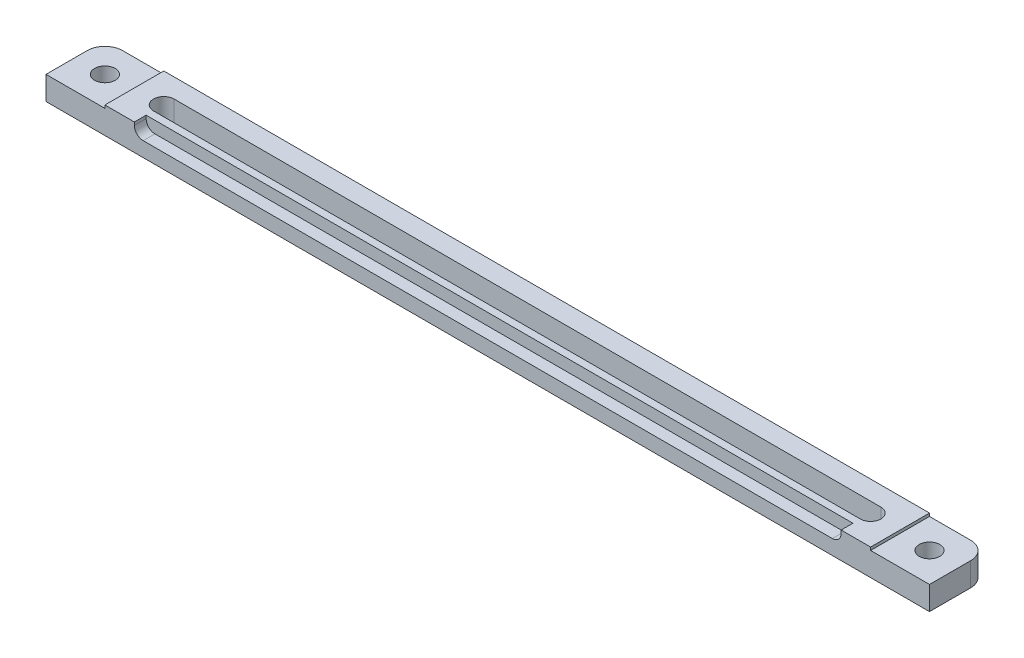
ISO-10303-21;
HEADER;
FILE_DESCRIPTION(('STEP AP214'),'2;1');
FILE_NAME('part.step','',(''),(''),'','','');
FILE_SCHEMA(('AUTOMOTIVE_DESIGN { 1 0 10303 214 1 1 1 1 }'));
ENDSEC;
DATA;
#1=APPLICATION_CONTEXT('core data for automotive mechanical design processes');
#2=APPLICATION_PROTOCOL_DEFINITION('international standard','automotive_design',2000,#1);
#3=PRODUCT_CONTEXT('',#1,'mechanical');
#4=PRODUCT('Part','Part','',(#3));
#5=PRODUCT_RELATED_PRODUCT_CATEGORY('part','',(#4));
#6=PRODUCT_DEFINITION_FORMATION('','',#4);
#7=PRODUCT_DEFINITION_CONTEXT('part definition',#1,'design');
#8=PRODUCT_DEFINITION('design','',#6,#7);
#9=PRODUCT_DEFINITION_SHAPE('','',#8);
#10=(LENGTH_UNIT() NAMED_UNIT(*) SI_UNIT(.MILLI.,.METRE.));
#11=(NAMED_UNIT(*) PLANE_ANGLE_UNIT() SI_UNIT($,.RADIAN.));
#12=(NAMED_UNIT(*) SI_UNIT($,.STERADIAN.) SOLID_ANGLE_UNIT());
#13=UNCERTAINTY_MEASURE_WITH_UNIT(LENGTH_MEASURE(1.E-05),#10,'distance_accuracy_value','');
#14=(GEOMETRIC_REPRESENTATION_CONTEXT(3) GLOBAL_UNCERTAINTY_ASSIGNED_CONTEXT((#13)) GLOBAL_UNIT_ASSIGNED_CONTEXT((#10,
#11,#12)) REPRESENTATION_CONTEXT('',''));
#15=CARTESIAN_POINT('',(0.,0.,0.));
#16=DIRECTION('',(0.,0.,1.));
#17=DIRECTION('',(1.,0.,0.));
#18=AXIS2_PLACEMENT_3D('',#15,#16,#17);
#19=CARTESIAN_POINT('',(0.,4.,0.));
#20=DIRECTION('',(0.,1.,0.));
#21=DIRECTION('',(0.,0.,1.));
#22=AXIS2_PLACEMENT_3D('',#19,#20,#21);
#23=PLANE('',#22);
#24=CARTESIAN_POINT('',(69.9999999999999,4.,0.));
#25=DIRECTION('',(0.,1.,0.));
#26=DIRECTION('',(0.,0.,1.));
#27=AXIS2_PLACEMENT_3D('',#24,#25,#26);
#28=CIRCLE('',#27,1.75);
#29=CARTESIAN_POINT('',(69.9999999999999,4.,1.74999999999999));
#30=VERTEX_POINT('',#29);
#31=EDGE_CURVE('E248',#30,#30,#28,.T.);
#32=ORIENTED_EDGE('',*,*,#31,.F.);
#33=EDGE_LOOP('',(#32));
#34=FACE_BOUND('',#33,.T.);
#35=DIRECTION('',(-1.,0.,0.));
#36=VECTOR('',#35,1.);
#37=CARTESIAN_POINT('',(0.,4.,-5.));
#38=LINE('',#37,#36);
#39=CARTESIAN_POINT('',(71.9999999999999,4.,-5.00000000000001));
#40=VERTEX_POINT('',#39);
#41=CARTESIAN_POINT('',(64.9999999999999,4.,-5.00000000000001));
#42=VERTEX_POINT('',#41);
#43=EDGE_CURVE('E253',#40,#42,#38,.T.);
#44=ORIENTED_EDGE('',*,*,#43,.T.);
#45=DIRECTION('',(0.,0.,1.));
#46=VECTOR('',#45,1.);
#47=CARTESIAN_POINT('',(64.9999999999999,4.,0.));
#48=LINE('',#47,#46);
#49=CARTESIAN_POINT('',(64.9999999999999,4.,4.99999999999999));
#50=VERTEX_POINT('',#49);
#51=EDGE_CURVE('E60',#42,#50,#48,.T.);
#52=ORIENTED_EDGE('',*,*,#51,.T.);
#53=DIRECTION('',(-1.,0.,0.));
#54=VECTOR('',#53,1.);
#55=CARTESIAN_POINT('',(0.,4.,5.));
#56=LINE('',#55,#54);
#57=CARTESIAN_POINT('',(74.9999999999999,4.,4.99999999999999));
#58=VERTEX_POINT('',#57);
#59=EDGE_CURVE('E261',#58,#50,#56,.T.);
#60=ORIENTED_EDGE('',*,*,#59,.F.);
#61=DIRECTION('',(0.,0.,1.));
#62=VECTOR('',#61,1.);
#63=CARTESIAN_POINT('',(74.9999999999999,4.,0.));
#64=LINE('',#63,#62);
#65=CARTESIAN_POINT('',(74.9999999999999,4.,-1.99999999999999));
#66=VERTEX_POINT('',#65);
#67=EDGE_CURVE('E263',#66,#58,#64,.T.);
#68=ORIENTED_EDGE('',*,*,#67,.F.);
#69=CARTESIAN_POINT('',(71.9999999999999,4.,-2.00000000000001));
#70=DIRECTION('',(0.,1.,0.));
#71=DIRECTION('',(0.,0.,1.));
#72=AXIS2_PLACEMENT_3D('',#69,#70,#71);
#73=CIRCLE('',#72,3.);
#74=EDGE_CURVE('E266',#66,#40,#73,.T.);
#75=ORIENTED_EDGE('',*,*,#74,.T.);
#76=EDGE_LOOP('',(#44,#52,#60,#68,#75));
#77=FACE_BOUND('',#76,.T.);
#78=ADVANCED_FACE('F35',(#34,#77),#23,.T.);
#79=CARTESIAN_POINT('',(0.,4.,-5.));
#80=DIRECTION('',(0.,0.,1.));
#81=DIRECTION('',(1.,0.,0.));
#82=AXIS2_PLACEMENT_3D('',#79,#80,#81);
#83=PLANE('',#82);
#84=DIRECTION('',(-1.,0.,0.));
#85=VECTOR('',#84,1.);
#86=CARTESIAN_POINT('',(0.,0.,-5.));
#87=LINE('',#86,#85);
#88=CARTESIAN_POINT('',(71.9999999999999,0.,-5.00000000000001));
#89=VERTEX_POINT('',#88);
#90=CARTESIAN_POINT('',(-72.0000000000001,0.,-4.99999999999999));
#91=VERTEX_POINT('',#90);
#92=EDGE_CURVE('E286',#89,#91,#87,.T.);
#93=ORIENTED_EDGE('',*,*,#92,.T.);
#94=DIRECTION('',(0.,-1.,0.));
#95=VECTOR('',#94,1.);
#96=CARTESIAN_POINT('',(-72.0000000000001,4.,-4.99999999999999));
#97=LINE('',#96,#95);
#98=CARTESIAN_POINT('',(-72.0000000000001,4.,-4.99999999999999));
#99=VERTEX_POINT('',#98);
#100=EDGE_CURVE('E11',#99,#91,#97,.T.);
#101=ORIENTED_EDGE('',*,*,#100,.F.);
#102=CARTESIAN_POINT('',(-65.0000000000001,4.,-4.99999999999999));
#103=VERTEX_POINT('',#102);
#104=EDGE_CURVE('E252',#103,#99,#38,.T.);
#105=ORIENTED_EDGE('',*,*,#104,.F.);
#106=DIRECTION('',(0.,-1.,0.));
#107=VECTOR('',#106,1.);
#108=CARTESIAN_POINT('',(-65.0000000000001,4.5,-4.99999999999999));
#109=LINE('',#108,#107);
#110=CARTESIAN_POINT('',(-65.0000000000001,4.5,-4.99999999999999));
#111=VERTEX_POINT('',#110);
#112=EDGE_CURVE('E238',#111,#103,#109,.T.);
#113=ORIENTED_EDGE('',*,*,#112,.F.);
#114=DIRECTION('',(-1.,0.,0.));
#115=VECTOR('',#114,1.);
#116=CARTESIAN_POINT('',(0.,4.5,-5.));
#117=LINE('',#116,#115);
#118=CARTESIAN_POINT('',(64.9999999999999,4.5,-5.00000000000001));
#119=VERTEX_POINT('',#118);
#120=EDGE_CURVE('E209',#119,#111,#117,.T.);
#121=ORIENTED_EDGE('',*,*,#120,.F.);
#122=DIRECTION('',(0.,-1.,0.));
#123=VECTOR('',#122,1.);
#124=CARTESIAN_POINT('',(64.9999999999999,4.5,-5.00000000000001));
#125=LINE('',#124,#123);
#126=EDGE_CURVE('E241',#119,#42,#125,.T.);
#127=ORIENTED_EDGE('',*,*,#126,.T.);
#128=ORIENTED_EDGE('',*,*,#43,.F.);
#129=DIRECTION('',(0.,-1.,0.));
#130=VECTOR('',#129,1.);
#131=CARTESIAN_POINT('',(71.9999999999999,4.,-5.00000000000001));
#132=LINE('',#131,#130);
#133=EDGE_CURVE('E301',#40,#89,#132,.T.);
#134=ORIENTED_EDGE('',*,*,#133,.T.);
#135=EDGE_LOOP('',(#93,#101,#105,#113,#121,#127,#128,#134));
#136=FACE_BOUND('',#135,.T.);
#137=ADVANCED_FACE('F345',(#136),#83,.F.);
#138=CARTESIAN_POINT('',(-72.0000000000001,4.,-1.99999999999999));
#139=DIRECTION('',(0.,-1.,0.));
#140=DIRECTION('',(0.,0.,-1.));
#141=AXIS2_PLACEMENT_3D('',#138,#139,#140);
#142=CYLINDRICAL_SURFACE('',#141,3.);
#143=CARTESIAN_POINT('',(-72.0000000000001,0.,-1.99999999999999));
#144=DIRECTION('',(0.,1.,0.));
#145=DIRECTION('',(0.,0.,1.));
#146=AXIS2_PLACEMENT_3D('',#143,#144,#145);
#147=CIRCLE('',#146,3.);
#148=CARTESIAN_POINT('',(-75.0000000000001,0.,-1.99999999999997));
#149=VERTEX_POINT('',#148);
#150=EDGE_CURVE('E289',#91,#149,#147,.T.);
#151=ORIENTED_EDGE('',*,*,#150,.T.);
#152=DIRECTION('',(0.,-1.,0.));
#153=VECTOR('',#152,1.);
#154=CARTESIAN_POINT('',(-75.0000000000001,4.,-1.99999999999997));
#155=LINE('',#154,#153);
#156=CARTESIAN_POINT('',(-75.0000000000001,4.,-1.99999999999997));
#157=VERTEX_POINT('',#156);
#158=EDGE_CURVE('E44',#157,#149,#155,.T.);
#159=ORIENTED_EDGE('',*,*,#158,.F.);
#160=CARTESIAN_POINT('',(-72.0000000000001,4.,-1.99999999999999));
#161=DIRECTION('',(0.,1.,0.));
#162=DIRECTION('',(0.,0.,1.));
#163=AXIS2_PLACEMENT_3D('',#160,#161,#162);
#164=CIRCLE('',#163,3.);
#165=EDGE_CURVE('E255',#99,#157,#164,.T.);
#166=ORIENTED_EDGE('',*,*,#165,.F.);
#167=ORIENTED_EDGE('',*,*,#100,.T.);
#168=EDGE_LOOP('',(#151,#159,#166,#167));
#169=FACE_BOUND('',#168,.T.);
#170=ADVANCED_FACE('F352',(#169),#142,.T.);
#171=CARTESIAN_POINT('',(-75.0000000000001,4.,0.));
#172=DIRECTION('',(1.,0.,0.));
#173=DIRECTION('',(0.,0.,-1.));
#174=AXIS2_PLACEMENT_3D('',#171,#172,#173);
#175=PLANE('',#174);
#176=DIRECTION('',(0.,0.,1.));
#177=VECTOR('',#176,1.);
#178=CARTESIAN_POINT('',(-75.0000000000001,0.,0.));
#179=LINE('',#178,#177);
#180=CARTESIAN_POINT('',(-75.0000000000001,0.,5.00000000000001));
#181=VERTEX_POINT('',#180);
#182=EDGE_CURVE('E291',#149,#181,#179,.T.);
#183=ORIENTED_EDGE('',*,*,#182,.T.);
#184=DIRECTION('',(0.,-1.,0.));
#185=VECTOR('',#184,1.);
#186=CARTESIAN_POINT('',(-75.0000000000001,4.,5.00000000000001));
#187=LINE('',#186,#185);
#188=CARTESIAN_POINT('',(-75.0000000000001,4.,5.00000000000001));
#189=VERTEX_POINT('',#188);
#190=EDGE_CURVE('E308',#189,#181,#187,.T.);
#191=ORIENTED_EDGE('',*,*,#190,.F.);
#192=DIRECTION('',(0.,0.,1.));
#193=VECTOR('',#192,1.);
#194=CARTESIAN_POINT('',(-75.0000000000001,4.,0.));
#195=LINE('',#194,#193);
#196=EDGE_CURVE('E257',#157,#189,#195,.T.);
#197=ORIENTED_EDGE('',*,*,#196,.F.);
#198=ORIENTED_EDGE('',*,*,#158,.T.);
#199=EDGE_LOOP('',(#183,#191,#197,#198));
#200=FACE_BOUND('',#199,.T.);
#201=ADVANCED_FACE('F397',(#200),#175,.F.);
#202=CARTESIAN_POINT('',(0.,4.,5.));
#203=DIRECTION('',(0.,0.,1.));
#204=DIRECTION('',(1.,0.,0.));
#205=AXIS2_PLACEMENT_3D('',#202,#203,#204);
#206=PLANE('',#205);
#207=DIRECTION('',(0.,1.,0.));
#208=VECTOR('',#207,1.);
#209=CARTESIAN_POINT('',(59.9999999999997,4.00000000000002,5.));
#210=LINE('',#209,#208);
#211=CARTESIAN_POINT('',(59.9999999999997,4.,5.));
#212=VERTEX_POINT('',#211);
#213=CARTESIAN_POINT('',(59.9999999999997,4.5,5.));
#214=VERTEX_POINT('',#213);
#215=EDGE_CURVE('E412',#212,#214,#210,.T.);
#216=ORIENTED_EDGE('',*,*,#215,.F.);
#217=CARTESIAN_POINT('',(58.4999999999997,4.,5.));
#218=DIRECTION('',(0.,0.,1.));
#219=DIRECTION('',(1.,0.,0.));
#220=AXIS2_PLACEMENT_3D('',#217,#218,#219);
#221=CIRCLE('',#220,1.5);
#222=CARTESIAN_POINT('',(58.4999999999997,2.5,5.));
#223=VERTEX_POINT('',#222);
#224=EDGE_CURVE('E428',#223,#212,#221,.T.);
#225=ORIENTED_EDGE('',*,*,#224,.F.);
#226=DIRECTION('',(1.,0.,0.));
#227=VECTOR('',#226,1.);
#228=CARTESIAN_POINT('',(-58.5000000000003,2.5,5.));
#229=LINE('',#228,#227);
#230=CARTESIAN_POINT('',(-58.5000000000003,2.5,5.));
#231=VERTEX_POINT('',#230);
#232=EDGE_CURVE('E425',#231,#223,#229,.T.);
#233=ORIENTED_EDGE('',*,*,#232,.F.);
#234=CARTESIAN_POINT('',(-58.5000000000003,4.,5.));
#235=DIRECTION('',(0.,0.,1.));
#236=DIRECTION('',(1.,0.,0.));
#237=AXIS2_PLACEMENT_3D('',#234,#235,#236);
#238=CIRCLE('',#237,1.5);
#239=CARTESIAN_POINT('',(-60.0000000000003,4.00000000000002,5.));
#240=VERTEX_POINT('',#239);
#241=EDGE_CURVE('E418',#240,#231,#238,.T.);
#242=ORIENTED_EDGE('',*,*,#241,.F.);
#243=DIRECTION('',(0.,-1.,0.));
#244=VECTOR('',#243,1.);
#245=CARTESIAN_POINT('',(-60.0000000000003,4.00000000000002,5.));
#246=LINE('',#245,#244);
#247=CARTESIAN_POINT('',(-60.0000000000003,4.5,5.));
#248=VERTEX_POINT('',#247);
#249=EDGE_CURVE('E416',#248,#240,#246,.T.);
#250=ORIENTED_EDGE('',*,*,#249,.F.);
#251=DIRECTION('',(1.,0.,0.));
#252=VECTOR('',#251,1.);
#253=CARTESIAN_POINT('',(0.,4.5,5.));
#254=LINE('',#253,#252);
#255=CARTESIAN_POINT('',(-65.0000000000001,4.5,5.00000000000001));
#256=VERTEX_POINT('',#255);
#257=EDGE_CURVE('E197',#256,#248,#254,.T.);
#258=ORIENTED_EDGE('',*,*,#257,.F.);
#259=DIRECTION('',(0.,-1.,0.));
#260=VECTOR('',#259,1.);
#261=CARTESIAN_POINT('',(-65.0000000000001,4.5,5.00000000000001));
#262=LINE('',#261,#260);
#263=CARTESIAN_POINT('',(-65.0000000000001,4.,5.00000000000001));
#264=VERTEX_POINT('',#263);
#265=EDGE_CURVE('E235',#256,#264,#262,.T.);
#266=ORIENTED_EDGE('',*,*,#265,.T.);
#267=EDGE_CURVE('E260',#264,#189,#56,.T.);
#268=ORIENTED_EDGE('',*,*,#267,.T.);
#269=ORIENTED_EDGE('',*,*,#190,.T.);
#270=DIRECTION('',(-1.,0.,0.));
#271=VECTOR('',#270,1.);
#272=CARTESIAN_POINT('',(0.,0.,5.));
#273=LINE('',#272,#271);
#274=CARTESIAN_POINT('',(74.9999999999999,0.,4.99999999999999));
#275=VERTEX_POINT('',#274);
#276=EDGE_CURVE('E294',#275,#181,#273,.T.);
#277=ORIENTED_EDGE('',*,*,#276,.F.);
#278=DIRECTION('',(0.,-1.,0.));
#279=VECTOR('',#278,1.);
#280=CARTESIAN_POINT('',(74.9999999999999,4.,4.99999999999999));
#281=LINE('',#280,#279);
#282=EDGE_CURVE('E306',#58,#275,#281,.T.);
#283=ORIENTED_EDGE('',*,*,#282,.F.);
#284=ORIENTED_EDGE('',*,*,#59,.T.);
#285=DIRECTION('',(0.,-1.,0.));
#286=VECTOR('',#285,1.);
#287=CARTESIAN_POINT('',(64.9999999999999,4.5,4.99999999999999));
#288=LINE('',#287,#286);
#289=CARTESIAN_POINT('',(64.9999999999999,4.5,4.99999999999999));
#290=VERTEX_POINT('',#289);
#291=EDGE_CURVE('E228',#290,#50,#288,.T.);
#292=ORIENTED_EDGE('',*,*,#291,.F.);
#293=EDGE_CURVE('E214',#214,#290,#254,.T.);
#294=ORIENTED_EDGE('',*,*,#293,.F.);
#295=EDGE_LOOP('',(#216,#225,#233,#242,#250,#258,#266,#268,#269,#277,#283,#284,#292,#294));
#296=FACE_BOUND('',#295,.T.);
#297=ADVANCED_FACE('F393',(#296),#206,.T.);
#298=CARTESIAN_POINT('',(74.9999999999999,4.,0.));
#299=DIRECTION('',(1.,0.,0.));
#300=DIRECTION('',(0.,0.,-1.));
#301=AXIS2_PLACEMENT_3D('',#298,#299,#300);
#302=PLANE('',#301);
#303=DIRECTION('',(0.,0.,1.));
#304=VECTOR('',#303,1.);
#305=CARTESIAN_POINT('',(74.9999999999999,0.,0.));
#306=LINE('',#305,#304);
#307=CARTESIAN_POINT('',(74.9999999999999,0.,-1.99999999999999));
#308=VERTEX_POINT('',#307);
#309=EDGE_CURVE('E297',#308,#275,#306,.T.);
#310=ORIENTED_EDGE('',*,*,#309,.F.);
#311=DIRECTION('',(0.,-1.,0.));
#312=VECTOR('',#311,1.);
#313=CARTESIAN_POINT('',(74.9999999999999,4.,-1.99999999999999));
#314=LINE('',#313,#312);
#315=EDGE_CURVE('E304',#66,#308,#314,.T.);
#316=ORIENTED_EDGE('',*,*,#315,.F.);
#317=ORIENTED_EDGE('',*,*,#67,.T.);
#318=ORIENTED_EDGE('',*,*,#282,.T.);
#319=EDGE_LOOP('',(#310,#316,#317,#318));
#320=FACE_BOUND('',#319,.T.);
#321=ADVANCED_FACE('F389',(#320),#302,.T.);
#322=CARTESIAN_POINT('',(59.9999999999999,4.,0.));
#323=DIRECTION('',(0.,-1.,0.));
#324=DIRECTION('',(0.,0.,-1.));
#325=AXIS2_PLACEMENT_3D('',#322,#323,#324);
#326=CYLINDRICAL_SURFACE('',#325,1.75);
#327=CARTESIAN_POINT('',(59.9999999999999,0.,0.));
#328=DIRECTION('',(0.,1.,0.));
#329=DIRECTION('',(0.,0.,1.));
#330=AXIS2_PLACEMENT_3D('',#327,#328,#329);
#331=CIRCLE('',#330,1.75);
#332=CARTESIAN_POINT('',(59.9999999999999,0.,1.74999999999999));
#333=VERTEX_POINT('',#332);
#334=CARTESIAN_POINT('',(59.9999999999999,0.,-1.75000000000001));
#335=VERTEX_POINT('',#334);
#336=EDGE_CURVE('E244',#333,#335,#331,.T.);
#337=ORIENTED_EDGE('',*,*,#336,.F.);
#338=DIRECTION('',(0.,-1.,0.));
#339=VECTOR('',#338,1.);
#340=CARTESIAN_POINT('',(59.9999999999999,4.,1.74999999999999));
#341=LINE('',#340,#339);
#342=CARTESIAN_POINT('',(59.9999999999999,4.5,1.74999999999999));
#343=VERTEX_POINT('',#342);
#344=EDGE_CURVE('E39',#343,#333,#341,.T.);
#345=ORIENTED_EDGE('',*,*,#344,.F.);
#346=CARTESIAN_POINT('',(59.9999999999999,4.5,0.));
#347=DIRECTION('',(0.,1.,0.));
#348=DIRECTION('',(0.,0.,1.));
#349=AXIS2_PLACEMENT_3D('',#346,#347,#348);
#350=CIRCLE('',#349,1.75);
#351=CARTESIAN_POINT('',(59.9999999999999,4.5,-1.75000000000001));
#352=VERTEX_POINT('',#351);
#353=EDGE_CURVE('E219',#352,#343,#350,.F.);
#354=ORIENTED_EDGE('',*,*,#353,.F.);
#355=DIRECTION('',(0.,-1.,0.));
#356=VECTOR('',#355,1.);
#357=CARTESIAN_POINT('',(59.9999999999999,4.,-1.75000000000001));
#358=LINE('',#357,#356);
#359=EDGE_CURVE('E268',#352,#335,#358,.T.);
#360=ORIENTED_EDGE('',*,*,#359,.T.);
#361=EDGE_LOOP('',(#337,#345,#354,#360));
#362=FACE_BOUND('',#361,.T.);
#363=ADVANCED_FACE('F37',(#362),#326,.F.);
#364=CARTESIAN_POINT('',(0.,4.,1.75));
#365=DIRECTION('',(0.,0.,1.));
#366=DIRECTION('',(1.,0.,0.));
#367=AXIS2_PLACEMENT_3D('',#364,#365,#366);
#368=PLANE('',#367);
#369=DIRECTION('',(-1.,0.,0.));
#370=VECTOR('',#369,1.);
#371=CARTESIAN_POINT('',(0.,0.,1.75));
#372=LINE('',#371,#370);
#373=CARTESIAN_POINT('',(-60.0000000000001,0.,1.75));
#374=VERTEX_POINT('',#373);
#375=EDGE_CURVE('E271',#333,#374,#372,.T.);
#376=ORIENTED_EDGE('',*,*,#375,.T.);
#377=DIRECTION('',(0.,-1.,0.));
#378=VECTOR('',#377,1.);
#379=CARTESIAN_POINT('',(-60.0000000000001,4.,1.75));
#380=LINE('',#379,#378);
#381=CARTESIAN_POINT('',(-60.0000000000001,4.5,1.75000000000001));
#382=VERTEX_POINT('',#381);
#383=EDGE_CURVE('E314',#382,#374,#380,.T.);
#384=ORIENTED_EDGE('',*,*,#383,.F.);
#385=DIRECTION('',(-1.,0.,0.));
#386=VECTOR('',#385,1.);
#387=CARTESIAN_POINT('',(0.,4.5,1.75));
#388=LINE('',#387,#386);
#389=EDGE_CURVE('E222',#343,#382,#388,.T.);
#390=ORIENTED_EDGE('',*,*,#389,.F.);
#391=ORIENTED_EDGE('',*,*,#344,.T.);
#392=EDGE_LOOP('',(#376,#384,#390,#391));
#393=FACE_BOUND('',#392,.T.);
#394=ADVANCED_FACE('F321',(#393),#368,.F.);
#395=CARTESIAN_POINT('',(-60.0000000000001,4.,0.));
#396=DIRECTION('',(0.,-1.,0.));
#397=DIRECTION('',(0.,0.,-1.));
#398=AXIS2_PLACEMENT_3D('',#395,#396,#397);
#399=CYLINDRICAL_SURFACE('',#398,1.75);
#400=CARTESIAN_POINT('',(-60.0000000000001,0.,0.));
#401=DIRECTION('',(0.,1.,0.));
#402=DIRECTION('',(0.,0.,1.));
#403=AXIS2_PLACEMENT_3D('',#400,#401,#402);
#404=CIRCLE('',#403,1.75);
#405=CARTESIAN_POINT('',(-60.0000000000001,0.,-1.75));
#406=VERTEX_POINT('',#405);
#407=EDGE_CURVE('E274',#406,#374,#404,.T.);
#408=ORIENTED_EDGE('',*,*,#407,.F.);
#409=DIRECTION('',(0.,-1.,0.));
#410=VECTOR('',#409,1.);
#411=CARTESIAN_POINT('',(-60.0000000000001,4.,-1.75));
#412=LINE('',#411,#410);
#413=CARTESIAN_POINT('',(-60.0000000000001,4.5,-1.75));
#414=VERTEX_POINT('',#413);
#415=EDGE_CURVE('E313',#414,#406,#412,.T.);
#416=ORIENTED_EDGE('',*,*,#415,.F.);
#417=CARTESIAN_POINT('',(-60.0000000000001,4.5,0.));
#418=DIRECTION('',(0.,1.,0.));
#419=DIRECTION('',(0.,0.,1.));
#420=AXIS2_PLACEMENT_3D('',#417,#418,#419);
#421=CIRCLE('',#420,1.75);
#422=EDGE_CURVE('E225',#382,#414,#421,.F.);
#423=ORIENTED_EDGE('',*,*,#422,.F.);
#424=ORIENTED_EDGE('',*,*,#383,.T.);
#425=EDGE_LOOP('',(#408,#416,#423,#424));
#426=FACE_BOUND('',#425,.T.);
#427=ADVANCED_FACE('F332',(#426),#399,.F.);
#428=CARTESIAN_POINT('',(69.9999999999999,4.,0.));
#429=DIRECTION('',(0.,-1.,0.));
#430=DIRECTION('',(0.,0.,-1.));
#431=AXIS2_PLACEMENT_3D('',#428,#429,#430);
#432=CYLINDRICAL_SURFACE('',#431,1.75);
#433=ORIENTED_EDGE('',*,*,#31,.T.);
#434=EDGE_LOOP('',(#433));
#435=FACE_BOUND('',#434,.T.);
#436=CARTESIAN_POINT('',(69.9999999999999,0.,0.));
#437=DIRECTION('',(0.,1.,0.));
#438=DIRECTION('',(0.,0.,1.));
#439=AXIS2_PLACEMENT_3D('',#436,#437,#438);
#440=CIRCLE('',#439,1.75);
#441=CARTESIAN_POINT('',(69.9999999999999,0.,1.74999999999999));
#442=VERTEX_POINT('',#441);
#443=EDGE_CURVE('E283',#442,#442,#440,.T.);
#444=ORIENTED_EDGE('',*,*,#443,.F.);
#445=EDGE_LOOP('',(#444));
#446=FACE_BOUND('',#445,.T.);
#447=ADVANCED_FACE('F334',(#435,#446),#432,.F.);
#448=CARTESIAN_POINT('',(-70.0000000000001,4.,0.));
#449=DIRECTION('',(0.,-1.,0.));
#450=DIRECTION('',(0.,0.,-1.));
#451=AXIS2_PLACEMENT_3D('',#448,#449,#450);
#452=CYLINDRICAL_SURFACE('',#451,1.75);
#453=CARTESIAN_POINT('',(-70.0000000000001,4.,0.));
#454=DIRECTION('',(0.,1.,0.));
#455=DIRECTION('',(0.,0.,1.));
#456=AXIS2_PLACEMENT_3D('',#453,#454,#455);
#457=CIRCLE('',#456,1.75);
#458=CARTESIAN_POINT('',(-70.0000000000001,4.,1.75));
#459=VERTEX_POINT('',#458);
#460=EDGE_CURVE('E245',#459,#459,#457,.T.);
#461=ORIENTED_EDGE('',*,*,#460,.T.);
#462=EDGE_LOOP('',(#461));
#463=FACE_BOUND('',#462,.T.);
#464=CARTESIAN_POINT('',(-70.0000000000001,0.,0.));
#465=DIRECTION('',(0.,1.,0.));
#466=DIRECTION('',(0.,0.,1.));
#467=AXIS2_PLACEMENT_3D('',#464,#465,#466);
#468=CIRCLE('',#467,1.75);
#469=CARTESIAN_POINT('',(-70.0000000000001,0.,1.75));
#470=VERTEX_POINT('',#469);
#471=EDGE_CURVE('E280',#470,#470,#468,.T.);
#472=ORIENTED_EDGE('',*,*,#471,.F.);
#473=EDGE_LOOP('',(#472));
#474=FACE_BOUND('',#473,.T.);
#475=ADVANCED_FACE('F340',(#463,#474),#452,.F.);
#476=CARTESIAN_POINT('',(0.,4.,-1.75));
#477=DIRECTION('',(0.,0.,1.));
#478=DIRECTION('',(1.,0.,0.));
#479=AXIS2_PLACEMENT_3D('',#476,#477,#478);
#480=PLANE('',#479);
#481=DIRECTION('',(-1.,0.,0.));
#482=VECTOR('',#481,1.);
#483=CARTESIAN_POINT('',(0.,0.,-1.75));
#484=LINE('',#483,#482);
#485=EDGE_CURVE('E277',#335,#406,#484,.T.);
#486=ORIENTED_EDGE('',*,*,#485,.F.);
#487=ORIENTED_EDGE('',*,*,#359,.F.);
#488=DIRECTION('',(1.,0.,0.));
#489=VECTOR('',#488,1.);
#490=CARTESIAN_POINT('',(0.,4.5,-1.75));
#491=LINE('',#490,#489);
#492=EDGE_CURVE('E216',#414,#352,#491,.T.);
#493=ORIENTED_EDGE('',*,*,#492,.F.);
#494=ORIENTED_EDGE('',*,*,#415,.T.);
#495=EDGE_LOOP('',(#486,#487,#493,#494));
#496=FACE_BOUND('',#495,.T.);
#497=ADVANCED_FACE('F331',(#496),#480,.T.);
#498=CARTESIAN_POINT('',(71.9999999999999,4.,-2.00000000000001));
#499=DIRECTION('',(0.,-1.,0.));
#500=DIRECTION('',(0.,0.,-1.));
#501=AXIS2_PLACEMENT_3D('',#498,#499,#500);
#502=CYLINDRICAL_SURFACE('',#501,3.);
#503=CARTESIAN_POINT('',(71.9999999999999,0.,-2.00000000000001));
#504=DIRECTION('',(0.,1.,0.));
#505=DIRECTION('',(0.,0.,1.));
#506=AXIS2_PLACEMENT_3D('',#503,#504,#505);
#507=CIRCLE('',#506,3.);
#508=EDGE_CURVE('E249',#308,#89,#507,.T.);
#509=ORIENTED_EDGE('',*,*,#508,.T.);
#510=ORIENTED_EDGE('',*,*,#133,.F.);
#511=ORIENTED_EDGE('',*,*,#74,.F.);
#512=ORIENTED_EDGE('',*,*,#315,.T.);
#513=EDGE_LOOP('',(#509,#510,#511,#512));
#514=FACE_BOUND('',#513,.T.);
#515=ADVANCED_FACE('F359',(#514),#502,.T.);
#516=DIRECTION('',(0.,0.,1.));
#517=VECTOR('',#516,1.);
#518=CARTESIAN_POINT('',(-65.0000000000001,4.,0.));
#519=LINE('',#518,#517);
#520=EDGE_CURVE('E210',#103,#264,#519,.T.);
#521=ORIENTED_EDGE('',*,*,#520,.F.);
#522=ORIENTED_EDGE('',*,*,#104,.T.);
#523=ORIENTED_EDGE('',*,*,#165,.T.);
#524=ORIENTED_EDGE('',*,*,#196,.T.);
#525=ORIENTED_EDGE('',*,*,#267,.F.);
#526=EDGE_LOOP('',(#521,#522,#523,#524,#525));
#527=FACE_BOUND('',#526,.T.);
#528=ORIENTED_EDGE('',*,*,#460,.F.);
#529=EDGE_LOOP('',(#528));
#530=FACE_BOUND('',#529,.T.);
#531=ADVANCED_FACE('F348',(#527,#530),#23,.T.);
#532=CARTESIAN_POINT('',(0.,0.,0.));
#533=DIRECTION('',(0.,1.,0.));
#534=DIRECTION('',(0.,0.,1.));
#535=AXIS2_PLACEMENT_3D('',#532,#533,#534);
#536=PLANE('',#535);
#537=ORIENTED_EDGE('',*,*,#336,.T.);
#538=ORIENTED_EDGE('',*,*,#485,.T.);
#539=ORIENTED_EDGE('',*,*,#407,.T.);
#540=ORIENTED_EDGE('',*,*,#375,.F.);
#541=EDGE_LOOP('',(#537,#538,#539,#540));
#542=FACE_BOUND('',#541,.T.);
#543=ORIENTED_EDGE('',*,*,#471,.T.);
#544=EDGE_LOOP('',(#543));
#545=FACE_BOUND('',#544,.T.);
#546=ORIENTED_EDGE('',*,*,#443,.T.);
#547=EDGE_LOOP('',(#546));
#548=FACE_BOUND('',#547,.T.);
#549=ORIENTED_EDGE('',*,*,#92,.F.);
#550=ORIENTED_EDGE('',*,*,#508,.F.);
#551=ORIENTED_EDGE('',*,*,#309,.T.);
#552=ORIENTED_EDGE('',*,*,#276,.T.);
#553=ORIENTED_EDGE('',*,*,#182,.F.);
#554=ORIENTED_EDGE('',*,*,#150,.F.);
#555=EDGE_LOOP('',(#549,#550,#551,#552,#553,#554));
#556=FACE_BOUND('',#555,.T.);
#557=ADVANCED_FACE('F326',(#542,#545,#548,#556),#536,.F.);
#558=CARTESIAN_POINT('',(64.9999999999999,4.5,0.));
#559=DIRECTION('',(1.,0.,0.));
#560=DIRECTION('',(0.,0.,-1.));
#561=AXIS2_PLACEMENT_3D('',#558,#559,#560);
#562=PLANE('',#561);
#563=ORIENTED_EDGE('',*,*,#51,.F.);
#564=ORIENTED_EDGE('',*,*,#126,.F.);
#565=DIRECTION('',(0.,0.,1.));
#566=VECTOR('',#565,1.);
#567=CARTESIAN_POINT('',(64.9999999999999,4.5,0.));
#568=LINE('',#567,#566);
#569=EDGE_CURVE('E206',#119,#290,#568,.T.);
#570=ORIENTED_EDGE('',*,*,#569,.T.);
#571=ORIENTED_EDGE('',*,*,#291,.T.);
#572=EDGE_LOOP('',(#563,#564,#570,#571));
#573=FACE_BOUND('',#572,.T.);
#574=ADVANCED_FACE('F365',(#573),#562,.T.);
#575=CARTESIAN_POINT('',(-65.0000000000001,4.5,0.));
#576=DIRECTION('',(1.,0.,0.));
#577=DIRECTION('',(0.,0.,-1.));
#578=AXIS2_PLACEMENT_3D('',#575,#576,#577);
#579=PLANE('',#578);
#580=ORIENTED_EDGE('',*,*,#520,.T.);
#581=ORIENTED_EDGE('',*,*,#265,.F.);
#582=DIRECTION('',(0.,0.,1.));
#583=VECTOR('',#582,1.);
#584=CARTESIAN_POINT('',(-65.0000000000001,4.5,0.));
#585=LINE('',#584,#583);
#586=EDGE_CURVE('E212',#111,#256,#585,.T.);
#587=ORIENTED_EDGE('',*,*,#586,.F.);
#588=ORIENTED_EDGE('',*,*,#112,.T.);
#589=EDGE_LOOP('',(#580,#581,#587,#588));
#590=FACE_BOUND('',#589,.T.);
#591=ADVANCED_FACE('F405',(#590),#579,.F.);
#592=CARTESIAN_POINT('',(0.,4.5,0.));
#593=DIRECTION('',(0.,1.,0.));
#594=DIRECTION('',(0.,0.,1.));
#595=AXIS2_PLACEMENT_3D('',#592,#593,#594);
#596=PLANE('',#595);
#597=DIRECTION('',(0.,0.,1.));
#598=VECTOR('',#597,1.);
#599=CARTESIAN_POINT('',(59.9999999999997,4.5,3.));
#600=LINE('',#599,#598);
#601=CARTESIAN_POINT('',(59.9999999999997,4.5,3.));
#602=VERTEX_POINT('',#601);
#603=EDGE_CURVE('E198',#602,#214,#600,.T.);
#604=ORIENTED_EDGE('',*,*,#603,.T.);
#605=ORIENTED_EDGE('',*,*,#293,.T.);
#606=ORIENTED_EDGE('',*,*,#569,.F.);
#607=ORIENTED_EDGE('',*,*,#120,.T.);
#608=ORIENTED_EDGE('',*,*,#586,.T.);
#609=ORIENTED_EDGE('',*,*,#257,.T.);
#610=DIRECTION('',(0.,0.,1.));
#611=VECTOR('',#610,1.);
#612=CARTESIAN_POINT('',(-60.0000000000003,4.5,3.));
#613=LINE('',#612,#611);
#614=CARTESIAN_POINT('',(-60.0000000000003,4.5,3.));
#615=VERTEX_POINT('',#614);
#616=EDGE_CURVE('E180',#615,#248,#613,.T.);
#617=ORIENTED_EDGE('',*,*,#616,.F.);
#618=DIRECTION('',(-1.,0.,0.));
#619=VECTOR('',#618,1.);
#620=CARTESIAN_POINT('',(-60.0000000000003,4.5,3.));
#621=LINE('',#620,#619);
#622=EDGE_CURVE('E186',#602,#615,#621,.T.);
#623=ORIENTED_EDGE('',*,*,#622,.F.);
#624=EDGE_LOOP('',(#604,#605,#606,#607,#608,#609,#617,#623));
#625=FACE_BOUND('',#624,.T.);
#626=ORIENTED_EDGE('',*,*,#492,.T.);
#627=ORIENTED_EDGE('',*,*,#353,.T.);
#628=ORIENTED_EDGE('',*,*,#389,.T.);
#629=ORIENTED_EDGE('',*,*,#422,.T.);
#630=EDGE_LOOP('',(#626,#627,#628,#629));
#631=FACE_BOUND('',#630,.T.);
#632=ADVANCED_FACE('F194',(#625,#631),#596,.T.);
#633=CARTESIAN_POINT('',(59.9999999999997,4.00000000000002,3.));
#634=DIRECTION('',(1.,0.,0.));
#635=DIRECTION('',(0.,0.,-1.));
#636=AXIS2_PLACEMENT_3D('',#633,#634,#635);
#637=PLANE('',#636);
#638=ORIENTED_EDGE('',*,*,#215,.T.);
#639=ORIENTED_EDGE('',*,*,#603,.F.);
#640=DIRECTION('',(0.,1.,0.));
#641=VECTOR('',#640,1.);
#642=CARTESIAN_POINT('',(59.9999999999997,4.00000000000002,3.));
#643=LINE('',#642,#641);
#644=CARTESIAN_POINT('',(59.9999999999997,4.,3.));
#645=VERTEX_POINT('',#644);
#646=EDGE_CURVE('E52',#645,#602,#643,.T.);
#647=ORIENTED_EDGE('',*,*,#646,.F.);
#648=DIRECTION('',(0.,0.,1.));
#649=VECTOR('',#648,1.);
#650=CARTESIAN_POINT('',(59.9999999999997,4.,3.));
#651=LINE('',#650,#649);
#652=EDGE_CURVE('E230',#645,#212,#651,.T.);
#653=ORIENTED_EDGE('',*,*,#652,.T.);
#654=EDGE_LOOP('',(#638,#639,#647,#653));
#655=FACE_BOUND('',#654,.T.);
#656=ADVANCED_FACE('F414',(#655),#637,.F.);
#657=CARTESIAN_POINT('',(58.4999999999997,4.,3.));
#658=DIRECTION('',(0.,0.,1.));
#659=DIRECTION('',(1.,0.,0.));
#660=AXIS2_PLACEMENT_3D('',#657,#658,#659);
#661=CYLINDRICAL_SURFACE('',#660,1.5);
#662=ORIENTED_EDGE('',*,*,#224,.T.);
#663=ORIENTED_EDGE('',*,*,#652,.F.);
#664=CARTESIAN_POINT('',(58.4999999999997,4.,3.));
#665=DIRECTION('',(0.,0.,1.));
#666=DIRECTION('',(1.,0.,0.));
#667=AXIS2_PLACEMENT_3D('',#664,#665,#666);
#668=CIRCLE('',#667,1.5);
#669=CARTESIAN_POINT('',(58.4999999999997,2.5,3.));
#670=VERTEX_POINT('',#669);
#671=EDGE_CURVE('E202',#670,#645,#668,.T.);
#672=ORIENTED_EDGE('',*,*,#671,.F.);
#673=DIRECTION('',(0.,0.,1.));
#674=VECTOR('',#673,1.);
#675=CARTESIAN_POINT('',(58.4999999999997,2.5,3.));
#676=LINE('',#675,#674);
#677=EDGE_CURVE('E431',#670,#223,#676,.T.);
#678=ORIENTED_EDGE('',*,*,#677,.T.);
#679=EDGE_LOOP('',(#662,#663,#672,#678));
#680=FACE_BOUND('',#679,.T.);
#681=ADVANCED_FACE('F442',(#680),#661,.F.);
#682=CARTESIAN_POINT('',(-58.5000000000003,2.5,3.));
#683=DIRECTION('',(0.,-1.,0.));
#684=DIRECTION('',(0.,0.,-1.));
#685=AXIS2_PLACEMENT_3D('',#682,#683,#684);
#686=PLANE('',#685);
#687=ORIENTED_EDGE('',*,*,#232,.T.);
#688=ORIENTED_EDGE('',*,*,#677,.F.);
#689=DIRECTION('',(1.,0.,0.));
#690=VECTOR('',#689,1.);
#691=CARTESIAN_POINT('',(-58.5000000000003,2.5,3.));
#692=LINE('',#691,#690);
#693=CARTESIAN_POINT('',(-58.5000000000003,2.5,3.));
#694=VERTEX_POINT('',#693);
#695=EDGE_CURVE('E437',#694,#670,#692,.T.);
#696=ORIENTED_EDGE('',*,*,#695,.F.);
#697=DIRECTION('',(0.,0.,1.));
#698=VECTOR('',#697,1.);
#699=CARTESIAN_POINT('',(-58.5000000000003,2.5,3.));
#700=LINE('',#699,#698);
#701=EDGE_CURVE('E200',#694,#231,#700,.T.);
#702=ORIENTED_EDGE('',*,*,#701,.T.);
#703=EDGE_LOOP('',(#687,#688,#696,#702));
#704=FACE_BOUND('',#703,.T.);
#705=ADVANCED_FACE('F434',(#704),#686,.F.);
#706=CARTESIAN_POINT('',(-58.5000000000003,4.,3.));
#707=DIRECTION('',(0.,0.,1.));
#708=DIRECTION('',(1.,0.,0.));
#709=AXIS2_PLACEMENT_3D('',#706,#707,#708);
#710=CYLINDRICAL_SURFACE('',#709,1.5);
#711=ORIENTED_EDGE('',*,*,#241,.T.);
#712=ORIENTED_EDGE('',*,*,#701,.F.);
#713=CARTESIAN_POINT('',(-58.5000000000003,4.,3.));
#714=DIRECTION('',(0.,0.,1.));
#715=DIRECTION('',(1.,0.,0.));
#716=AXIS2_PLACEMENT_3D('',#713,#714,#715);
#717=CIRCLE('',#716,1.5);
#718=CARTESIAN_POINT('',(-60.0000000000003,4.00000000000002,3.));
#719=VERTEX_POINT('',#718);
#720=EDGE_CURVE('E185',#719,#694,#717,.T.);
#721=ORIENTED_EDGE('',*,*,#720,.F.);
#722=DIRECTION('',(0.,0.,1.));
#723=VECTOR('',#722,1.);
#724=CARTESIAN_POINT('',(-60.0000000000003,4.00000000000002,3.));
#725=LINE('',#724,#723);
#726=EDGE_CURVE('E182',#719,#240,#725,.T.);
#727=ORIENTED_EDGE('',*,*,#726,.T.);
#728=EDGE_LOOP('',(#711,#712,#721,#727));
#729=FACE_BOUND('',#728,.T.);
#730=ADVANCED_FACE('F440',(#729),#710,.F.);
#731=CARTESIAN_POINT('',(-60.0000000000003,4.00000000000002,3.));
#732=DIRECTION('',(-1.,0.,0.));
#733=DIRECTION('',(0.,0.,1.));
#734=AXIS2_PLACEMENT_3D('',#731,#732,#733);
#735=PLANE('',#734);
#736=ORIENTED_EDGE('',*,*,#249,.T.);
#737=ORIENTED_EDGE('',*,*,#726,.F.);
#738=DIRECTION('',(0.,-1.,0.));
#739=VECTOR('',#738,1.);
#740=CARTESIAN_POINT('',(-60.0000000000003,4.00000000000002,3.));
#741=LINE('',#740,#739);
#742=EDGE_CURVE('E176',#615,#719,#741,.T.);
#743=ORIENTED_EDGE('',*,*,#742,.F.);
#744=ORIENTED_EDGE('',*,*,#616,.T.);
#745=EDGE_LOOP('',(#736,#737,#743,#744));
#746=FACE_BOUND('',#745,.T.);
#747=ADVANCED_FACE('F178',(#746),#735,.F.);
#748=CARTESIAN_POINT('',(-58.5000000000003,4.,3.));
#749=DIRECTION('',(0.,0.,1.));
#750=DIRECTION('',(1.,0.,0.));
#751=AXIS2_PLACEMENT_3D('',#748,#749,#750);
#752=PLANE('',#751);
#753=ORIENTED_EDGE('',*,*,#646,.T.);
#754=ORIENTED_EDGE('',*,*,#622,.T.);
#755=ORIENTED_EDGE('',*,*,#742,.T.);
#756=ORIENTED_EDGE('',*,*,#720,.T.);
#757=ORIENTED_EDGE('',*,*,#695,.T.);
#758=ORIENTED_EDGE('',*,*,#671,.T.);
#759=EDGE_LOOP('',(#753,#754,#755,#756,#757,#758));
#760=FACE_BOUND('',#759,.T.);
#761=ADVANCED_FACE('F189',(#760),#752,.T.);
#762=CLOSED_SHELL('',(#78,#137,#170,#201,#297,#321,#363,#394,#427,#447,#475,#497,#515,#531,#557,
#574,#591,#632,#656,#681,#705,#730,#747,#761));
#763=MANIFOLD_SOLID_BREP('B2',#762);
#764=ADVANCED_BREP_SHAPE_REPRESENTATION('',(#18,#763),#14);
#765=SHAPE_DEFINITION_REPRESENTATION(#9,#764);
ENDSEC;
END-ISO-10303-21;
